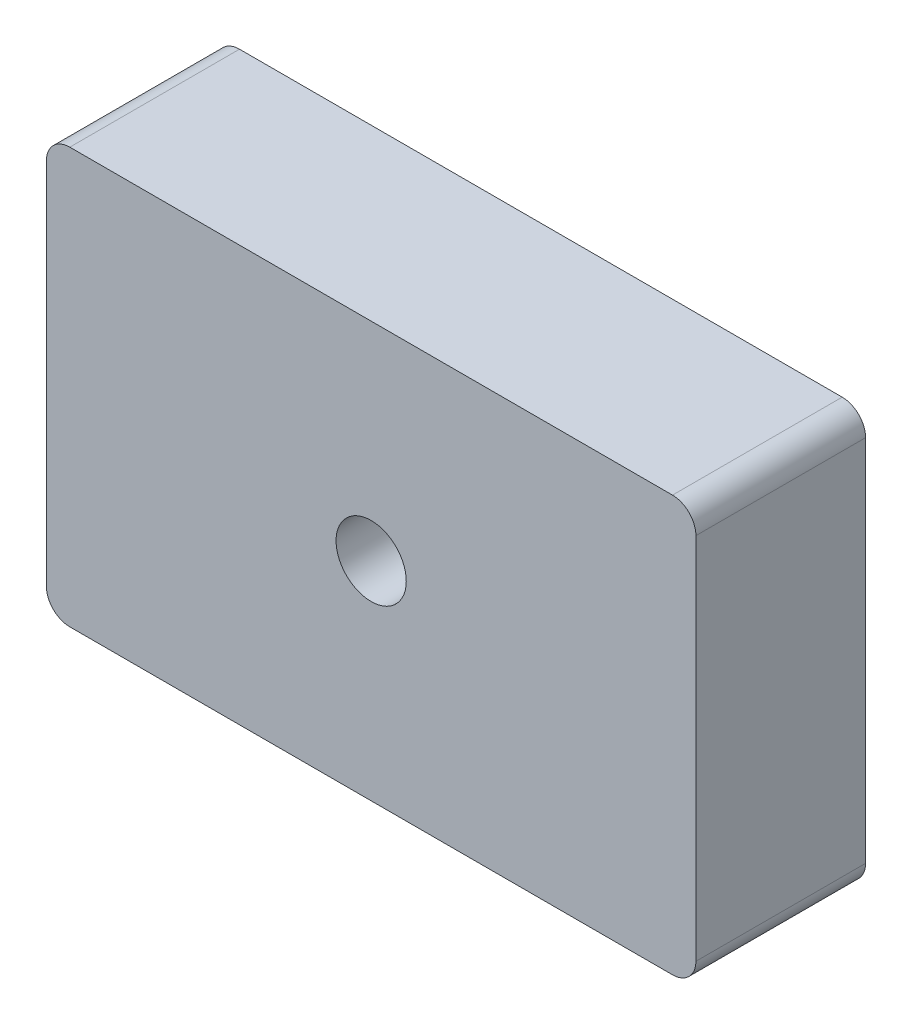
ISO-10303-21;
HEADER;
FILE_DESCRIPTION(('STEP AP214'),'2;1');
FILE_NAME('part.step','',(''),(''),'','','');
FILE_SCHEMA(('AUTOMOTIVE_DESIGN { 1 0 10303 214 1 1 1 1 }'));
ENDSEC;
DATA;
#1=APPLICATION_CONTEXT('core data for automotive mechanical design processes');
#2=APPLICATION_PROTOCOL_DEFINITION('international standard','automotive_design',2000,#1);
#3=PRODUCT_CONTEXT('',#1,'mechanical');
#4=PRODUCT('Part','Part','',(#3));
#5=PRODUCT_RELATED_PRODUCT_CATEGORY('part','',(#4));
#6=PRODUCT_DEFINITION_FORMATION('','',#4);
#7=PRODUCT_DEFINITION_CONTEXT('part definition',#1,'design');
#8=PRODUCT_DEFINITION('design','',#6,#7);
#9=PRODUCT_DEFINITION_SHAPE('','',#8);
#10=(LENGTH_UNIT() NAMED_UNIT(*) SI_UNIT(.MILLI.,.METRE.));
#11=(NAMED_UNIT(*) PLANE_ANGLE_UNIT() SI_UNIT($,.RADIAN.));
#12=(NAMED_UNIT(*) SI_UNIT($,.STERADIAN.) SOLID_ANGLE_UNIT());
#13=UNCERTAINTY_MEASURE_WITH_UNIT(LENGTH_MEASURE(1.E-05),#10,'distance_accuracy_value','');
#14=(GEOMETRIC_REPRESENTATION_CONTEXT(3) GLOBAL_UNCERTAINTY_ASSIGNED_CONTEXT((#13)) GLOBAL_UNIT_ASSIGNED_CONTEXT((#10,
#11,#12)) REPRESENTATION_CONTEXT('',''));
#15=CARTESIAN_POINT('',(0.,0.,0.));
#16=DIRECTION('',(0.,0.,1.));
#17=DIRECTION('',(1.,0.,0.));
#18=AXIS2_PLACEMENT_3D('',#15,#16,#17);
#19=CARTESIAN_POINT('',(35.242,-22.5425,18.415));
#20=DIRECTION('',(-1.,0.,0.));
#21=DIRECTION('',(0.,0.,1.));
#22=AXIS2_PLACEMENT_3D('',#19,#20,#21);
#23=PLANE('',#22);
#24=DIRECTION('',(0.,1.,0.));
#25=VECTOR('',#24,1.);
#26=CARTESIAN_POINT('',(35.242,-22.5425,18.415));
#27=LINE('',#26,#25);
#28=CARTESIAN_POINT('',(35.242,-20.0025,18.415));
#29=VERTEX_POINT('',#28);
#30=CARTESIAN_POINT('',(35.242,20.0025,18.415));
#31=VERTEX_POINT('',#30);
#32=EDGE_CURVE('E130',#29,#31,#27,.T.);
#33=ORIENTED_EDGE('',*,*,#32,.F.);
#34=DIRECTION('',(0.,0.,-1.));
#35=VECTOR('',#34,1.);
#36=CARTESIAN_POINT('',(35.242,-20.0025,18.415));
#37=LINE('',#36,#35);
#38=CARTESIAN_POINT('',(35.242,-20.0025,0.));
#39=VERTEX_POINT('',#38);
#40=EDGE_CURVE('E114',#29,#39,#37,.T.);
#41=ORIENTED_EDGE('',*,*,#40,.T.);
#42=DIRECTION('',(0.,1.,0.));
#43=VECTOR('',#42,1.);
#44=CARTESIAN_POINT('',(35.242,-22.5425,0.));
#45=LINE('',#44,#43);
#46=CARTESIAN_POINT('',(35.242,20.0025,0.));
#47=VERTEX_POINT('',#46);
#48=EDGE_CURVE('E127',#39,#47,#45,.T.);
#49=ORIENTED_EDGE('',*,*,#48,.T.);
#50=DIRECTION('',(0.,0.,-1.));
#51=VECTOR('',#50,1.);
#52=CARTESIAN_POINT('',(35.242,20.0025,18.415));
#53=LINE('',#52,#51);
#54=EDGE_CURVE('E133',#47,#31,#53,.F.);
#55=ORIENTED_EDGE('',*,*,#54,.T.);
#56=EDGE_LOOP('',(#33,#41,#49,#55));
#57=FACE_BOUND('',#56,.T.);
#58=ADVANCED_FACE('F43',(#57),#23,.F.);
#59=CARTESIAN_POINT('',(-35.242,22.5425,18.415));
#60=DIRECTION('',(0.,-1.,0.));
#61=DIRECTION('',(0.,0.,-1.));
#62=AXIS2_PLACEMENT_3D('',#59,#60,#61);
#63=PLANE('',#62);
#64=DIRECTION('',(-1.,0.,0.));
#65=VECTOR('',#64,1.);
#66=CARTESIAN_POINT('',(-35.242,22.5425,0.));
#67=LINE('',#66,#65);
#68=CARTESIAN_POINT('',(32.702,22.5425,0.));
#69=VERTEX_POINT('',#68);
#70=CARTESIAN_POINT('',(-32.702,22.5425,0.));
#71=VERTEX_POINT('',#70);
#72=EDGE_CURVE('E139',#69,#71,#67,.T.);
#73=ORIENTED_EDGE('',*,*,#72,.T.);
#74=DIRECTION('',(0.,0.,-1.));
#75=VECTOR('',#74,1.);
#76=CARTESIAN_POINT('',(-32.702,22.5425,18.415));
#77=LINE('',#76,#75);
#78=CARTESIAN_POINT('',(-32.702,22.5425,18.415));
#79=VERTEX_POINT('',#78);
#80=EDGE_CURVE('E11',#71,#79,#77,.F.);
#81=ORIENTED_EDGE('',*,*,#80,.T.);
#82=DIRECTION('',(-1.,0.,0.));
#83=VECTOR('',#82,1.);
#84=CARTESIAN_POINT('',(-35.242,22.5425,18.415));
#85=LINE('',#84,#83);
#86=CARTESIAN_POINT('',(32.702,22.5425,18.415));
#87=VERTEX_POINT('',#86);
#88=EDGE_CURVE('E195',#87,#79,#85,.T.);
#89=ORIENTED_EDGE('',*,*,#88,.F.);
#90=DIRECTION('',(0.,0.,-1.));
#91=VECTOR('',#90,1.);
#92=CARTESIAN_POINT('',(32.702,22.5425,18.415));
#93=LINE('',#92,#91);
#94=EDGE_CURVE('E52',#87,#69,#93,.T.);
#95=ORIENTED_EDGE('',*,*,#94,.T.);
#96=EDGE_LOOP('',(#73,#81,#89,#95));
#97=FACE_BOUND('',#96,.T.);
#98=ADVANCED_FACE('F193',(#97),#63,.F.);
#99=CARTESIAN_POINT('',(-35.242,-22.5425,18.415));
#100=DIRECTION('',(1.,0.,0.));
#101=DIRECTION('',(0.,0.,-1.));
#102=AXIS2_PLACEMENT_3D('',#99,#100,#101);
#103=PLANE('',#102);
#104=DIRECTION('',(0.,-1.,0.));
#105=VECTOR('',#104,1.);
#106=CARTESIAN_POINT('',(-35.242,-22.5425,18.415));
#107=LINE('',#106,#105);
#108=CARTESIAN_POINT('',(-35.242,20.0025,18.415));
#109=VERTEX_POINT('',#108);
#110=CARTESIAN_POINT('',(-35.242,-20.0025,18.415));
#111=VERTEX_POINT('',#110);
#112=EDGE_CURVE('E203',#109,#111,#107,.T.);
#113=ORIENTED_EDGE('',*,*,#112,.F.);
#114=DIRECTION('',(0.,0.,-1.));
#115=VECTOR('',#114,1.);
#116=CARTESIAN_POINT('',(-35.242,20.0025,18.415));
#117=LINE('',#116,#115);
#118=CARTESIAN_POINT('',(-35.242,20.0025,0.));
#119=VERTEX_POINT('',#118);
#120=EDGE_CURVE('E185',#109,#119,#117,.T.);
#121=ORIENTED_EDGE('',*,*,#120,.T.);
#122=DIRECTION('',(0.,-1.,0.));
#123=VECTOR('',#122,1.);
#124=CARTESIAN_POINT('',(-35.242,-22.5425,0.));
#125=LINE('',#124,#123);
#126=CARTESIAN_POINT('',(-35.242,-20.0025,0.));
#127=VERTEX_POINT('',#126);
#128=EDGE_CURVE('E146',#119,#127,#125,.T.);
#129=ORIENTED_EDGE('',*,*,#128,.T.);
#130=DIRECTION('',(0.,0.,-1.));
#131=VECTOR('',#130,1.);
#132=CARTESIAN_POINT('',(-35.242,-20.0025,18.415));
#133=LINE('',#132,#131);
#134=EDGE_CURVE('E59',#127,#111,#133,.F.);
#135=ORIENTED_EDGE('',*,*,#134,.T.);
#136=EDGE_LOOP('',(#113,#121,#129,#135));
#137=FACE_BOUND('',#136,.T.);
#138=ADVANCED_FACE('F202',(#137),#103,.F.);
#139=CARTESIAN_POINT('',(-35.242,-22.5425,18.415));
#140=DIRECTION('',(0.,1.,0.));
#141=DIRECTION('',(0.,0.,1.));
#142=AXIS2_PLACEMENT_3D('',#139,#140,#141);
#143=PLANE('',#142);
#144=DIRECTION('',(1.,0.,0.));
#145=VECTOR('',#144,1.);
#146=CARTESIAN_POINT('',(-35.242,-22.5425,0.));
#147=LINE('',#146,#145);
#148=CARTESIAN_POINT('',(-32.702,-22.5425,0.));
#149=VERTEX_POINT('',#148);
#150=CARTESIAN_POINT('',(32.702,-22.5425,0.));
#151=VERTEX_POINT('',#150);
#152=EDGE_CURVE('E158',#149,#151,#147,.T.);
#153=ORIENTED_EDGE('',*,*,#152,.T.);
#154=DIRECTION('',(0.,0.,-1.));
#155=VECTOR('',#154,1.);
#156=CARTESIAN_POINT('',(32.702,-22.5425,18.415));
#157=LINE('',#156,#155);
#158=CARTESIAN_POINT('',(32.702,-22.5425,18.415));
#159=VERTEX_POINT('',#158);
#160=EDGE_CURVE('E115',#151,#159,#157,.F.);
#161=ORIENTED_EDGE('',*,*,#160,.T.);
#162=DIRECTION('',(1.,0.,0.));
#163=VECTOR('',#162,1.);
#164=CARTESIAN_POINT('',(-35.242,-22.5425,18.415));
#165=LINE('',#164,#163);
#166=CARTESIAN_POINT('',(-32.702,-22.5425,18.415));
#167=VERTEX_POINT('',#166);
#168=EDGE_CURVE('E153',#167,#159,#165,.T.);
#169=ORIENTED_EDGE('',*,*,#168,.F.);
#170=DIRECTION('',(0.,0.,-1.));
#171=VECTOR('',#170,1.);
#172=CARTESIAN_POINT('',(-32.702,-22.5425,18.415));
#173=LINE('',#172,#171);
#174=EDGE_CURVE('E121',#167,#149,#173,.T.);
#175=ORIENTED_EDGE('',*,*,#174,.T.);
#176=EDGE_LOOP('',(#153,#161,#169,#175));
#177=FACE_BOUND('',#176,.T.);
#178=ADVANCED_FACE('F221',(#177),#143,.F.);
#179=CARTESIAN_POINT('',(0.,0.,18.415));
#180=DIRECTION('',(0.,0.,-1.));
#181=DIRECTION('',(-1.,0.,0.));
#182=AXIS2_PLACEMENT_3D('',#179,#180,#181);
#183=PLANE('',#182);
#184=CARTESIAN_POINT('',(0.,0.,18.415));
#185=DIRECTION('',(0.,0.,1.));
#186=DIRECTION('',(1.,0.,0.));
#187=AXIS2_PLACEMENT_3D('',#184,#185,#186);
#188=CIRCLE('',#187,3.81);
#189=CARTESIAN_POINT('',(3.80999999999999,0.,18.415));
#190=VERTEX_POINT('',#189);
#191=EDGE_CURVE('E150',#190,#190,#188,.T.);
#192=ORIENTED_EDGE('',*,*,#191,.F.);
#193=EDGE_LOOP('',(#192));
#194=FACE_BOUND('',#193,.T.);
#195=ORIENTED_EDGE('',*,*,#168,.T.);
#196=CARTESIAN_POINT('',(32.702,-20.0025,18.415));
#197=DIRECTION('',(0.,0.,-1.));
#198=DIRECTION('',(-1.,0.,0.));
#199=AXIS2_PLACEMENT_3D('',#196,#197,#198);
#200=CIRCLE('',#199,2.54);
#201=EDGE_CURVE('E180',#159,#29,#200,.F.);
#202=ORIENTED_EDGE('',*,*,#201,.T.);
#203=ORIENTED_EDGE('',*,*,#32,.T.);
#204=CARTESIAN_POINT('',(32.702,20.0025,18.415));
#205=DIRECTION('',(0.,0.,-1.));
#206=DIRECTION('',(-1.,0.,0.));
#207=AXIS2_PLACEMENT_3D('',#204,#205,#206);
#208=CIRCLE('',#207,2.54);
#209=EDGE_CURVE('E176',#31,#87,#208,.F.);
#210=ORIENTED_EDGE('',*,*,#209,.T.);
#211=ORIENTED_EDGE('',*,*,#88,.T.);
#212=CARTESIAN_POINT('',(-32.702,20.0025,18.415));
#213=DIRECTION('',(0.,0.,-1.));
#214=DIRECTION('',(-1.,0.,0.));
#215=AXIS2_PLACEMENT_3D('',#212,#213,#214);
#216=CIRCLE('',#215,2.54);
#217=EDGE_CURVE('E66',#79,#109,#216,.F.);
#218=ORIENTED_EDGE('',*,*,#217,.T.);
#219=ORIENTED_EDGE('',*,*,#112,.T.);
#220=CARTESIAN_POINT('',(-32.702,-20.0025,18.415));
#221=DIRECTION('',(0.,0.,-1.));
#222=DIRECTION('',(-1.,0.,0.));
#223=AXIS2_PLACEMENT_3D('',#220,#221,#222);
#224=CIRCLE('',#223,2.54);
#225=EDGE_CURVE('E173',#111,#167,#224,.F.);
#226=ORIENTED_EDGE('',*,*,#225,.T.);
#227=EDGE_LOOP('',(#195,#202,#203,#210,#211,#218,#219,#226));
#228=FACE_BOUND('',#227,.T.);
#229=ADVANCED_FACE('F219',(#194,#228),#183,.F.);
#230=CARTESIAN_POINT('',(0.,0.,0.));
#231=DIRECTION('',(0.,0.,-1.));
#232=DIRECTION('',(-1.,0.,0.));
#233=AXIS2_PLACEMENT_3D('',#230,#231,#232);
#234=PLANE('',#233);
#235=CARTESIAN_POINT('',(0.,0.,0.));
#236=DIRECTION('',(0.,0.,1.));
#237=DIRECTION('',(1.,0.,0.));
#238=AXIS2_PLACEMENT_3D('',#235,#236,#237);
#239=CIRCLE('',#238,3.81);
#240=CARTESIAN_POINT('',(3.80999999999999,0.,0.));
#241=VERTEX_POINT('',#240);
#242=EDGE_CURVE('E140',#241,#241,#239,.T.);
#243=ORIENTED_EDGE('',*,*,#242,.T.);
#244=EDGE_LOOP('',(#243));
#245=FACE_BOUND('',#244,.T.);
#246=ORIENTED_EDGE('',*,*,#48,.F.);
#247=CARTESIAN_POINT('',(32.702,-20.0025,0.));
#248=DIRECTION('',(0.,0.,-1.));
#249=DIRECTION('',(-1.,0.,0.));
#250=AXIS2_PLACEMENT_3D('',#247,#248,#249);
#251=CIRCLE('',#250,2.54);
#252=EDGE_CURVE('E110',#39,#151,#251,.T.);
#253=ORIENTED_EDGE('',*,*,#252,.T.);
#254=ORIENTED_EDGE('',*,*,#152,.F.);
#255=CARTESIAN_POINT('',(-32.702,-20.0025,0.));
#256=DIRECTION('',(0.,0.,-1.));
#257=DIRECTION('',(-1.,0.,0.));
#258=AXIS2_PLACEMENT_3D('',#255,#256,#257);
#259=CIRCLE('',#258,2.54);
#260=EDGE_CURVE('E132',#149,#127,#259,.T.);
#261=ORIENTED_EDGE('',*,*,#260,.T.);
#262=ORIENTED_EDGE('',*,*,#128,.F.);
#263=CARTESIAN_POINT('',(-32.702,20.0025,0.));
#264=DIRECTION('',(0.,0.,-1.));
#265=DIRECTION('',(-1.,0.,0.));
#266=AXIS2_PLACEMENT_3D('',#263,#264,#265);
#267=CIRCLE('',#266,2.54);
#268=EDGE_CURVE('E122',#119,#71,#267,.T.);
#269=ORIENTED_EDGE('',*,*,#268,.T.);
#270=ORIENTED_EDGE('',*,*,#72,.F.);
#271=CARTESIAN_POINT('',(32.702,20.0025,0.));
#272=DIRECTION('',(0.,0.,-1.));
#273=DIRECTION('',(-1.,0.,0.));
#274=AXIS2_PLACEMENT_3D('',#271,#272,#273);
#275=CIRCLE('',#274,2.54);
#276=EDGE_CURVE('E137',#69,#47,#275,.T.);
#277=ORIENTED_EDGE('',*,*,#276,.T.);
#278=EDGE_LOOP('',(#246,#253,#254,#261,#262,#269,#270,#277));
#279=FACE_BOUND('',#278,.T.);
#280=ADVANCED_FACE('F135',(#245,#279),#234,.T.);
#281=CARTESIAN_POINT('',(32.702,-20.0025,18.415));
#282=DIRECTION('',(0.,0.,-1.));
#283=DIRECTION('',(-1.,0.,0.));
#284=AXIS2_PLACEMENT_3D('',#281,#282,#283);
#285=CYLINDRICAL_SURFACE('',#284,2.54);
#286=ORIENTED_EDGE('',*,*,#201,.F.);
#287=ORIENTED_EDGE('',*,*,#160,.F.);
#288=ORIENTED_EDGE('',*,*,#252,.F.);
#289=ORIENTED_EDGE('',*,*,#40,.F.);
#290=EDGE_LOOP('',(#286,#287,#288,#289));
#291=FACE_BOUND('',#290,.T.);
#292=ADVANCED_FACE('F113',(#291),#285,.T.);
#293=CARTESIAN_POINT('',(-32.702,20.0025,18.415));
#294=DIRECTION('',(0.,0.,-1.));
#295=DIRECTION('',(-1.,0.,0.));
#296=AXIS2_PLACEMENT_3D('',#293,#294,#295);
#297=CYLINDRICAL_SURFACE('',#296,2.54);
#298=ORIENTED_EDGE('',*,*,#217,.F.);
#299=ORIENTED_EDGE('',*,*,#80,.F.);
#300=ORIENTED_EDGE('',*,*,#268,.F.);
#301=ORIENTED_EDGE('',*,*,#120,.F.);
#302=EDGE_LOOP('',(#298,#299,#300,#301));
#303=FACE_BOUND('',#302,.T.);
#304=ADVANCED_FACE('F201',(#303),#297,.T.);
#305=CARTESIAN_POINT('',(32.702,20.0025,18.415));
#306=DIRECTION('',(0.,0.,-1.));
#307=DIRECTION('',(-1.,0.,0.));
#308=AXIS2_PLACEMENT_3D('',#305,#306,#307);
#309=CYLINDRICAL_SURFACE('',#308,2.54);
#310=ORIENTED_EDGE('',*,*,#209,.F.);
#311=ORIENTED_EDGE('',*,*,#54,.F.);
#312=ORIENTED_EDGE('',*,*,#276,.F.);
#313=ORIENTED_EDGE('',*,*,#94,.F.);
#314=EDGE_LOOP('',(#310,#311,#312,#313));
#315=FACE_BOUND('',#314,.T.);
#316=ADVANCED_FACE('F228',(#315),#309,.T.);
#317=CARTESIAN_POINT('',(-32.702,-20.0025,18.415));
#318=DIRECTION('',(0.,0.,-1.));
#319=DIRECTION('',(-1.,0.,0.));
#320=AXIS2_PLACEMENT_3D('',#317,#318,#319);
#321=CYLINDRICAL_SURFACE('',#320,2.54);
#322=ORIENTED_EDGE('',*,*,#225,.F.);
#323=ORIENTED_EDGE('',*,*,#134,.F.);
#324=ORIENTED_EDGE('',*,*,#260,.F.);
#325=ORIENTED_EDGE('',*,*,#174,.F.);
#326=EDGE_LOOP('',(#322,#323,#324,#325));
#327=FACE_BOUND('',#326,.T.);
#328=ADVANCED_FACE('F45',(#327),#321,.T.);
#329=CARTESIAN_POINT('',(0.,0.,0.));
#330=DIRECTION('',(0.,0.,1.));
#331=DIRECTION('',(1.,0.,0.));
#332=AXIS2_PLACEMENT_3D('',#329,#330,#331);
#333=CYLINDRICAL_SURFACE('',#332,3.81);
#334=ORIENTED_EDGE('',*,*,#242,.F.);
#335=EDGE_LOOP('',(#334));
#336=FACE_BOUND('',#335,.T.);
#337=ORIENTED_EDGE('',*,*,#191,.T.);
#338=EDGE_LOOP('',(#337));
#339=FACE_BOUND('',#338,.T.);
#340=ADVANCED_FACE('F217',(#336,#339),#333,.F.);
#341=CLOSED_SHELL('',(#58,#98,#138,#178,#229,#280,#292,#304,#316,#328,#340));
#342=MANIFOLD_SOLID_BREP('B2',#341);
#343=ADVANCED_BREP_SHAPE_REPRESENTATION('',(#18,#342),#14);
#344=SHAPE_DEFINITION_REPRESENTATION(#9,#343);
ENDSEC;
END-ISO-10303-21;
